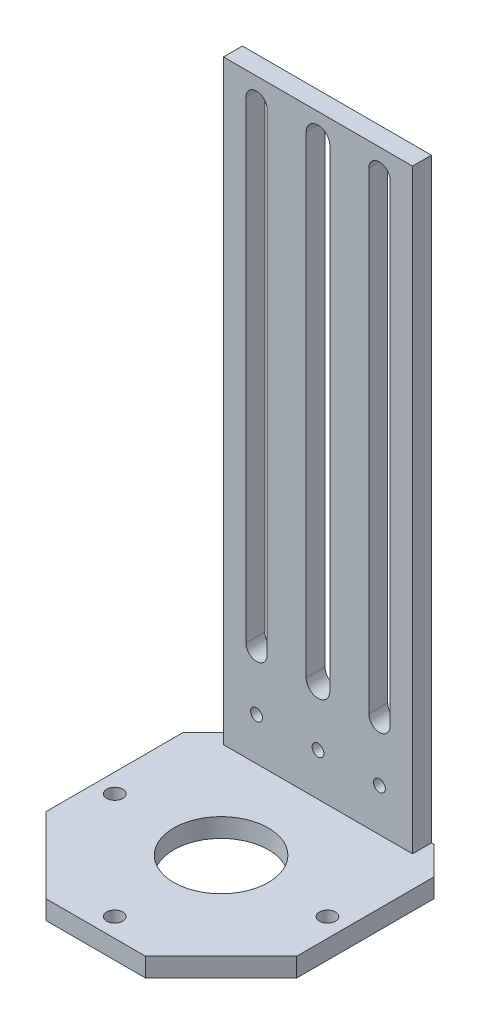
ISO-10303-21;
HEADER;
FILE_DESCRIPTION(('STEP AP214'),'2;1');
FILE_NAME('part.step','',(''),(''),'','','');
FILE_SCHEMA(('AUTOMOTIVE_DESIGN { 1 0 10303 214 1 1 1 1 }'));
ENDSEC;
DATA;
#1=APPLICATION_CONTEXT('core data for automotive mechanical design processes');
#2=APPLICATION_PROTOCOL_DEFINITION('international standard','automotive_design',2000,#1);
#3=PRODUCT_CONTEXT('',#1,'mechanical');
#4=PRODUCT('Part','Part','',(#3));
#5=PRODUCT_RELATED_PRODUCT_CATEGORY('part','',(#4));
#6=PRODUCT_DEFINITION_FORMATION('','',#4);
#7=PRODUCT_DEFINITION_CONTEXT('part definition',#1,'design');
#8=PRODUCT_DEFINITION('design','',#6,#7);
#9=PRODUCT_DEFINITION_SHAPE('','',#8);
#10=(LENGTH_UNIT() NAMED_UNIT(*) SI_UNIT(.MILLI.,.METRE.));
#11=(NAMED_UNIT(*) PLANE_ANGLE_UNIT() SI_UNIT($,.RADIAN.));
#12=(NAMED_UNIT(*) SI_UNIT($,.STERADIAN.) SOLID_ANGLE_UNIT());
#13=UNCERTAINTY_MEASURE_WITH_UNIT(LENGTH_MEASURE(1.E-05),#10,'distance_accuracy_value','');
#14=(GEOMETRIC_REPRESENTATION_CONTEXT(3) GLOBAL_UNCERTAINTY_ASSIGNED_CONTEXT((#13)) GLOBAL_UNIT_ASSIGNED_CONTEXT((#10,
#11,#12)) REPRESENTATION_CONTEXT('',''));
#15=CARTESIAN_POINT('',(0.,0.,0.));
#16=DIRECTION('',(0.,0.,1.));
#17=DIRECTION('',(1.,0.,0.));
#18=AXIS2_PLACEMENT_3D('',#15,#16,#17);
#19=CARTESIAN_POINT('',(26.5,130.,4.));
#20=DIRECTION('',(0.,0.,-1.));
#21=DIRECTION('',(0.,1.,0.));
#22=AXIS2_PLACEMENT_3D('',#19,#20,#21);
#23=PLANE('',#22);
#24=DIRECTION('',(0.,-1.,0.));
#25=VECTOR('',#24,1.);
#26=CARTESIAN_POINT('',(20.,130.,4.));
#27=LINE('',#26,#25);
#28=CARTESIAN_POINT('',(20.,4.,4.));
#29=VERTEX_POINT('',#28);
#30=CARTESIAN_POINT('',(20.,130.,4.));
#31=VERTEX_POINT('',#30);
#32=EDGE_CURVE('E401',#29,#31,#27,.F.);
#33=ORIENTED_EDGE('',*,*,#32,.T.);
#34=DIRECTION('',(1.,0.,0.));
#35=VECTOR('',#34,1.);
#36=CARTESIAN_POINT('',(26.5,130.,4.));
#37=LINE('',#36,#35);
#38=CARTESIAN_POINT('',(-20.,130.,4.));
#39=VERTEX_POINT('',#38);
#40=EDGE_CURVE('E396',#31,#39,#37,.F.);
#41=ORIENTED_EDGE('',*,*,#40,.T.);
#42=DIRECTION('',(0.,1.,0.));
#43=VECTOR('',#42,1.);
#44=CARTESIAN_POINT('',(-20.,130.,4.));
#45=LINE('',#44,#43);
#46=CARTESIAN_POINT('',(-20.,4.,4.));
#47=VERTEX_POINT('',#46);
#48=EDGE_CURVE('E387',#39,#47,#45,.F.);
#49=ORIENTED_EDGE('',*,*,#48,.T.);
#50=DIRECTION('',(1.,0.,0.));
#51=VECTOR('',#50,1.);
#52=CARTESIAN_POINT('',(26.5,4.00000000000001,4.));
#53=LINE('',#52,#51);
#54=EDGE_CURVE('E334',#47,#29,#53,.T.);
#55=ORIENTED_EDGE('',*,*,#54,.T.);
#56=EDGE_LOOP('',(#33,#41,#49,#55));
#57=FACE_BOUND('',#56,.T.);
#58=CARTESIAN_POINT('',(-13.,125.,4.));
#59=DIRECTION('',(0.,0.,-1.));
#60=DIRECTION('',(-1.,0.,0.));
#61=AXIS2_PLACEMENT_3D('',#58,#59,#60);
#62=CIRCLE('',#61,2.24999999999999);
#63=CARTESIAN_POINT('',(-15.25,125.,4.));
#64=VERTEX_POINT('',#63);
#65=CARTESIAN_POINT('',(-10.75,125.,4.));
#66=VERTEX_POINT('',#65);
#67=EDGE_CURVE('E254',#64,#66,#62,.T.);
#68=ORIENTED_EDGE('',*,*,#67,.T.);
#69=DIRECTION('',(0.,1.,0.));
#70=VECTOR('',#69,1.);
#71=CARTESIAN_POINT('',(-10.75,125.,4.));
#72=LINE('',#71,#70);
#73=CARTESIAN_POINT('',(-10.75,25.,4.));
#74=VERTEX_POINT('',#73);
#75=EDGE_CURVE('E308',#66,#74,#72,.F.);
#76=ORIENTED_EDGE('',*,*,#75,.T.);
#77=CARTESIAN_POINT('',(-13.,25.,4.));
#78=DIRECTION('',(0.,0.,-1.));
#79=DIRECTION('',(-1.,0.,0.));
#80=AXIS2_PLACEMENT_3D('',#77,#78,#79);
#81=CIRCLE('',#80,2.24999999999999);
#82=CARTESIAN_POINT('',(-15.25,25.,4.));
#83=VERTEX_POINT('',#82);
#84=EDGE_CURVE('E259',#74,#83,#81,.T.);
#85=ORIENTED_EDGE('',*,*,#84,.T.);
#86=DIRECTION('',(0.,-1.,0.));
#87=VECTOR('',#86,1.);
#88=CARTESIAN_POINT('',(-15.25,125.,4.));
#89=LINE('',#88,#87);
#90=EDGE_CURVE('E262',#83,#64,#89,.F.);
#91=ORIENTED_EDGE('',*,*,#90,.T.);
#92=EDGE_LOOP('',(#68,#76,#85,#91));
#93=FACE_BOUND('',#92,.T.);
#94=CARTESIAN_POINT('',(13.,125.,4.));
#95=DIRECTION('',(0.,0.,-1.));
#96=DIRECTION('',(-1.,0.,0.));
#97=AXIS2_PLACEMENT_3D('',#94,#95,#96);
#98=CIRCLE('',#97,2.24999999999999);
#99=CARTESIAN_POINT('',(10.75,125.,4.));
#100=VERTEX_POINT('',#99);
#101=CARTESIAN_POINT('',(15.25,125.,4.));
#102=VERTEX_POINT('',#101);
#103=EDGE_CURVE('E264',#100,#102,#98,.T.);
#104=ORIENTED_EDGE('',*,*,#103,.T.);
#105=DIRECTION('',(0.,1.,0.));
#106=VECTOR('',#105,1.);
#107=CARTESIAN_POINT('',(15.25,125.,4.));
#108=LINE('',#107,#106);
#109=CARTESIAN_POINT('',(15.25,25.,4.));
#110=VERTEX_POINT('',#109);
#111=EDGE_CURVE('E313',#102,#110,#108,.F.);
#112=ORIENTED_EDGE('',*,*,#111,.T.);
#113=CARTESIAN_POINT('',(13.,25.,4.));
#114=DIRECTION('',(0.,0.,-1.));
#115=DIRECTION('',(-1.,0.,0.));
#116=AXIS2_PLACEMENT_3D('',#113,#114,#115);
#117=CIRCLE('',#116,2.24999999999999);
#118=CARTESIAN_POINT('',(10.75,25.,4.));
#119=VERTEX_POINT('',#118);
#120=EDGE_CURVE('E269',#110,#119,#117,.T.);
#121=ORIENTED_EDGE('',*,*,#120,.T.);
#122=DIRECTION('',(0.,-1.,0.));
#123=VECTOR('',#122,1.);
#124=CARTESIAN_POINT('',(10.75,125.,4.));
#125=LINE('',#124,#123);
#126=EDGE_CURVE('E205',#119,#100,#125,.F.);
#127=ORIENTED_EDGE('',*,*,#126,.T.);
#128=EDGE_LOOP('',(#104,#112,#121,#127));
#129=FACE_BOUND('',#128,.T.);
#130=CARTESIAN_POINT('',(0.,25.,4.));
#131=DIRECTION('',(0.,0.,-1.));
#132=DIRECTION('',(-1.,0.,0.));
#133=AXIS2_PLACEMENT_3D('',#130,#131,#132);
#134=CIRCLE('',#133,2.5);
#135=CARTESIAN_POINT('',(2.5,25.,4.));
#136=VERTEX_POINT('',#135);
#137=CARTESIAN_POINT('',(-2.5,25.,4.));
#138=VERTEX_POINT('',#137);
#139=EDGE_CURVE('E197',#136,#138,#134,.T.);
#140=ORIENTED_EDGE('',*,*,#139,.T.);
#141=DIRECTION('',(0.,1.,0.));
#142=VECTOR('',#141,1.);
#143=CARTESIAN_POINT('',(-2.5,25.,4.));
#144=LINE('',#143,#142);
#145=CARTESIAN_POINT('',(-2.5,125.,4.));
#146=VERTEX_POINT('',#145);
#147=EDGE_CURVE('E190',#138,#146,#144,.T.);
#148=ORIENTED_EDGE('',*,*,#147,.T.);
#149=CARTESIAN_POINT('',(0.,125.,4.));
#150=DIRECTION('',(0.,0.,-1.));
#151=DIRECTION('',(-1.,0.,0.));
#152=AXIS2_PLACEMENT_3D('',#149,#150,#151);
#153=CIRCLE('',#152,2.5);
#154=CARTESIAN_POINT('',(2.5,125.,4.));
#155=VERTEX_POINT('',#154);
#156=EDGE_CURVE('E175',#146,#155,#153,.T.);
#157=ORIENTED_EDGE('',*,*,#156,.T.);
#158=DIRECTION('',(0.,1.,0.));
#159=VECTOR('',#158,1.);
#160=CARTESIAN_POINT('',(2.5,25.,4.));
#161=LINE('',#160,#159);
#162=EDGE_CURVE('E185',#155,#136,#161,.F.);
#163=ORIENTED_EDGE('',*,*,#162,.T.);
#164=EDGE_LOOP('',(#140,#148,#157,#163));
#165=FACE_BOUND('',#164,.T.);
#166=CARTESIAN_POINT('',(0.,13.,4.));
#167=DIRECTION('',(0.,0.,-1.));
#168=DIRECTION('',(-1.,0.,0.));
#169=AXIS2_PLACEMENT_3D('',#166,#167,#168);
#170=CIRCLE('',#169,1.24999999999999);
#171=CARTESIAN_POINT('',(-1.24999999999999,13.,4.));
#172=VERTEX_POINT('',#171);
#173=EDGE_CURVE('E186',#172,#172,#170,.T.);
#174=ORIENTED_EDGE('',*,*,#173,.T.);
#175=EDGE_LOOP('',(#174));
#176=FACE_BOUND('',#175,.T.);
#177=CARTESIAN_POINT('',(-13.,13.,4.));
#178=DIRECTION('',(0.,0.,-1.));
#179=DIRECTION('',(-1.,0.,0.));
#180=AXIS2_PLACEMENT_3D('',#177,#178,#179);
#181=CIRCLE('',#180,1.24999999999999);
#182=CARTESIAN_POINT('',(-14.25,13.,4.));
#183=VERTEX_POINT('',#182);
#184=EDGE_CURVE('E275',#183,#183,#181,.T.);
#185=ORIENTED_EDGE('',*,*,#184,.T.);
#186=EDGE_LOOP('',(#185));
#187=FACE_BOUND('',#186,.T.);
#188=CARTESIAN_POINT('',(13.,13.,4.));
#189=DIRECTION('',(0.,0.,-1.));
#190=DIRECTION('',(-1.,0.,0.));
#191=AXIS2_PLACEMENT_3D('',#188,#189,#190);
#192=CIRCLE('',#191,1.24999999999999);
#193=CARTESIAN_POINT('',(11.75,13.,4.));
#194=VERTEX_POINT('',#193);
#195=EDGE_CURVE('E278',#194,#194,#192,.T.);
#196=ORIENTED_EDGE('',*,*,#195,.T.);
#197=EDGE_LOOP('',(#196));
#198=FACE_BOUND('',#197,.T.);
#199=ADVANCED_FACE('F16',(#57,#93,#129,#165,#176,#187,#198),#23,.F.);
#200=CARTESIAN_POINT('',(-22.5,4.,24.5));
#201=DIRECTION('',(0.,1.,0.));
#202=DIRECTION('',(0.,0.,1.));
#203=AXIS2_PLACEMENT_3D('',#200,#201,#202);
#204=CYLINDRICAL_SURFACE('',#203,1.69999999999999);
#205=CARTESIAN_POINT('',(-22.5,0.,24.5));
#206=DIRECTION('',(0.,1.,0.));
#207=DIRECTION('',(0.,0.,1.));
#208=AXIS2_PLACEMENT_3D('',#205,#206,#207);
#209=CIRCLE('',#208,1.69999999999999);
#210=CARTESIAN_POINT('',(-22.5,0.,26.2));
#211=VERTEX_POINT('',#210);
#212=EDGE_CURVE('E250',#211,#211,#209,.F.);
#213=ORIENTED_EDGE('',*,*,#212,.T.);
#214=EDGE_LOOP('',(#213));
#215=FACE_BOUND('',#214,.T.);
#216=CARTESIAN_POINT('',(-22.5,4.00000000000001,24.5));
#217=DIRECTION('',(0.,1.,0.));
#218=DIRECTION('',(0.,0.,1.));
#219=AXIS2_PLACEMENT_3D('',#216,#217,#218);
#220=CIRCLE('',#219,1.69999999999999);
#221=CARTESIAN_POINT('',(-22.5,4.00000000000001,26.2));
#222=VERTEX_POINT('',#221);
#223=EDGE_CURVE('E19',#222,#222,#220,.T.);
#224=ORIENTED_EDGE('',*,*,#223,.T.);
#225=EDGE_LOOP('',(#224));
#226=FACE_BOUND('',#225,.T.);
#227=ADVANCED_FACE('F436',(#215,#226),#204,.F.);
#228=CARTESIAN_POINT('',(22.5,4.,24.5));
#229=DIRECTION('',(0.,1.,0.));
#230=DIRECTION('',(0.,0.,1.));
#231=AXIS2_PLACEMENT_3D('',#228,#229,#230);
#232=CYLINDRICAL_SURFACE('',#231,1.69999999999999);
#233=CARTESIAN_POINT('',(22.5,0.,24.5));
#234=DIRECTION('',(0.,1.,0.));
#235=DIRECTION('',(0.,0.,1.));
#236=AXIS2_PLACEMENT_3D('',#233,#234,#235);
#237=CIRCLE('',#236,1.69999999999999);
#238=CARTESIAN_POINT('',(22.5,0.,26.2));
#239=VERTEX_POINT('',#238);
#240=EDGE_CURVE('E247',#239,#239,#237,.F.);
#241=ORIENTED_EDGE('',*,*,#240,.T.);
#242=EDGE_LOOP('',(#241));
#243=FACE_BOUND('',#242,.T.);
#244=CARTESIAN_POINT('',(22.5,4.00000000000001,24.5));
#245=DIRECTION('',(0.,1.,0.));
#246=DIRECTION('',(0.,0.,1.));
#247=AXIS2_PLACEMENT_3D('',#244,#245,#246);
#248=CIRCLE('',#247,1.69999999999999);
#249=CARTESIAN_POINT('',(22.5,4.00000000000001,26.2));
#250=VERTEX_POINT('',#249);
#251=EDGE_CURVE('E288',#250,#250,#248,.T.);
#252=ORIENTED_EDGE('',*,*,#251,.T.);
#253=EDGE_LOOP('',(#252));
#254=FACE_BOUND('',#253,.T.);
#255=ADVANCED_FACE('F442',(#243,#254),#232,.F.);
#256=CARTESIAN_POINT('',(0.,4.,47.));
#257=DIRECTION('',(0.,1.,0.));
#258=DIRECTION('',(0.,0.,1.));
#259=AXIS2_PLACEMENT_3D('',#256,#257,#258);
#260=CYLINDRICAL_SURFACE('',#259,1.69999999999999);
#261=CARTESIAN_POINT('',(0.,0.,47.));
#262=DIRECTION('',(0.,1.,0.));
#263=DIRECTION('',(0.,0.,1.));
#264=AXIS2_PLACEMENT_3D('',#261,#262,#263);
#265=CIRCLE('',#264,1.69999999999999);
#266=CARTESIAN_POINT('',(0.,0.,48.7));
#267=VERTEX_POINT('',#266);
#268=EDGE_CURVE('E244',#267,#267,#265,.F.);
#269=ORIENTED_EDGE('',*,*,#268,.T.);
#270=EDGE_LOOP('',(#269));
#271=FACE_BOUND('',#270,.T.);
#272=CARTESIAN_POINT('',(0.,4.,47.));
#273=DIRECTION('',(0.,1.,0.));
#274=DIRECTION('',(0.,0.,1.));
#275=AXIS2_PLACEMENT_3D('',#272,#273,#274);
#276=CIRCLE('',#275,1.69999999999999);
#277=CARTESIAN_POINT('',(0.,4.,48.7));
#278=VERTEX_POINT('',#277);
#279=EDGE_CURVE('E286',#278,#278,#276,.T.);
#280=ORIENTED_EDGE('',*,*,#279,.T.);
#281=EDGE_LOOP('',(#280));
#282=FACE_BOUND('',#281,.T.);
#283=ADVANCED_FACE('F542',(#271,#282),#260,.F.);
#284=CARTESIAN_POINT('',(0.,0.,24.5));
#285=DIRECTION('',(0.,1.,0.));
#286=DIRECTION('',(0.,0.,1.));
#287=AXIS2_PLACEMENT_3D('',#284,#285,#286);
#288=CYLINDRICAL_SURFACE('',#287,10.);
#289=CARTESIAN_POINT('',(0.,0.,24.5));
#290=DIRECTION('',(0.,1.,0.));
#291=DIRECTION('',(0.,0.,1.));
#292=AXIS2_PLACEMENT_3D('',#289,#290,#291);
#293=CIRCLE('',#292,10.);
#294=CARTESIAN_POINT('',(0.,0.,34.5));
#295=VERTEX_POINT('',#294);
#296=EDGE_CURVE('E240',#295,#295,#293,.F.);
#297=ORIENTED_EDGE('',*,*,#296,.T.);
#298=EDGE_LOOP('',(#297));
#299=FACE_BOUND('',#298,.T.);
#300=CARTESIAN_POINT('',(0.,4.,24.5));
#301=DIRECTION('',(0.,1.,0.));
#302=DIRECTION('',(0.,0.,1.));
#303=AXIS2_PLACEMENT_3D('',#300,#301,#302);
#304=CIRCLE('',#303,10.);
#305=CARTESIAN_POINT('',(0.,4.,34.5));
#306=VERTEX_POINT('',#305);
#307=EDGE_CURVE('E282',#306,#306,#304,.T.);
#308=ORIENTED_EDGE('',*,*,#307,.T.);
#309=EDGE_LOOP('',(#308));
#310=FACE_BOUND('',#309,.T.);
#311=ADVANCED_FACE('F538',(#299,#310),#288,.F.);
#312=CARTESIAN_POINT('',(-26.5,0.,0.));
#313=DIRECTION('',(1.,0.,0.));
#314=DIRECTION('',(0.,0.,-1.));
#315=AXIS2_PLACEMENT_3D('',#312,#313,#314);
#316=PLANE('',#315);
#317=DIRECTION('',(0.,1.,0.));
#318=VECTOR('',#317,1.);
#319=CARTESIAN_POINT('',(-26.5,0.,6.00000000000003));
#320=LINE('',#319,#318);
#321=CARTESIAN_POINT('',(-26.5,4.00000000000001,6.00000000000003));
#322=VERTEX_POINT('',#321);
#323=CARTESIAN_POINT('',(-26.5,0.,6.00000000000003));
#324=VERTEX_POINT('',#323);
#325=EDGE_CURVE('E253',#322,#324,#320,.F.);
#326=ORIENTED_EDGE('',*,*,#325,.T.);
#327=DIRECTION('',(0.,0.,1.));
#328=VECTOR('',#327,1.);
#329=CARTESIAN_POINT('',(-26.5,0.,51.));
#330=LINE('',#329,#328);
#331=CARTESIAN_POINT('',(-26.5,0.,35.));
#332=VERTEX_POINT('',#331);
#333=EDGE_CURVE('E378',#324,#332,#330,.T.);
#334=ORIENTED_EDGE('',*,*,#333,.T.);
#335=DIRECTION('',(0.,1.,0.));
#336=VECTOR('',#335,1.);
#337=CARTESIAN_POINT('',(-26.5,4.,35.));
#338=LINE('',#337,#336);
#339=CARTESIAN_POINT('',(-26.5,4.,35.));
#340=VERTEX_POINT('',#339);
#341=EDGE_CURVE('E302',#332,#340,#338,.T.);
#342=ORIENTED_EDGE('',*,*,#341,.T.);
#343=DIRECTION('',(0.,0.,-1.));
#344=VECTOR('',#343,1.);
#345=CARTESIAN_POINT('',(-26.5,4.00000000000001,4.));
#346=LINE('',#345,#344);
#347=EDGE_CURVE('E338',#340,#322,#346,.T.);
#348=ORIENTED_EDGE('',*,*,#347,.T.);
#349=EDGE_LOOP('',(#326,#334,#342,#348));
#350=FACE_BOUND('',#349,.T.);
#351=ADVANCED_FACE('F534',(#350),#316,.F.);
#352=CARTESIAN_POINT('',(-10.5,4.,51.));
#353=DIRECTION('',(0.707106781186549,0.,-0.707106781186546));
#354=DIRECTION('',(-0.707106781186546,0.,-0.707106781186549));
#355=AXIS2_PLACEMENT_3D('',#352,#353,#354);
#356=PLANE('',#355);
#357=ORIENTED_EDGE('',*,*,#341,.F.);
#358=DIRECTION('',(0.707106781186546,0.,0.707106781186549));
#359=VECTOR('',#358,1.);
#360=CARTESIAN_POINT('',(-26.5,0.,35.));
#361=LINE('',#360,#359);
#362=CARTESIAN_POINT('',(-10.5,0.,51.));
#363=VERTEX_POINT('',#362);
#364=EDGE_CURVE('E375',#332,#363,#361,.T.);
#365=ORIENTED_EDGE('',*,*,#364,.T.);
#366=DIRECTION('',(0.,1.,0.));
#367=VECTOR('',#366,1.);
#368=CARTESIAN_POINT('',(-10.5,4.,51.));
#369=LINE('',#368,#367);
#370=CARTESIAN_POINT('',(-10.5,4.,51.));
#371=VERTEX_POINT('',#370);
#372=EDGE_CURVE('E296',#363,#371,#369,.T.);
#373=ORIENTED_EDGE('',*,*,#372,.T.);
#374=DIRECTION('',(-0.707106781186546,0.,-0.707106781186549));
#375=VECTOR('',#374,1.);
#376=CARTESIAN_POINT('',(-10.5,4.,51.));
#377=LINE('',#376,#375);
#378=EDGE_CURVE('E340',#371,#340,#377,.T.);
#379=ORIENTED_EDGE('',*,*,#378,.T.);
#380=EDGE_LOOP('',(#357,#365,#373,#379));
#381=FACE_BOUND('',#380,.T.);
#382=ADVANCED_FACE('F531',(#381),#356,.F.);
#383=CARTESIAN_POINT('',(26.5,4.,51.));
#384=DIRECTION('',(0.,0.,-1.));
#385=DIRECTION('',(-1.,0.,0.));
#386=AXIS2_PLACEMENT_3D('',#383,#384,#385);
#387=PLANE('',#386);
#388=ORIENTED_EDGE('',*,*,#372,.F.);
#389=DIRECTION('',(1.,0.,0.));
#390=VECTOR('',#389,1.);
#391=CARTESIAN_POINT('',(26.5,0.,51.));
#392=LINE('',#391,#390);
#393=CARTESIAN_POINT('',(10.4999999999999,0.,51.));
#394=VERTEX_POINT('',#393);
#395=EDGE_CURVE('E372',#363,#394,#392,.T.);
#396=ORIENTED_EDGE('',*,*,#395,.T.);
#397=DIRECTION('',(0.,1.,0.));
#398=VECTOR('',#397,1.);
#399=CARTESIAN_POINT('',(10.4999999999999,0.,51.));
#400=LINE('',#399,#398);
#401=CARTESIAN_POINT('',(10.4999999999999,4.,51.));
#402=VERTEX_POINT('',#401);
#403=EDGE_CURVE('E293',#402,#394,#400,.F.);
#404=ORIENTED_EDGE('',*,*,#403,.F.);
#405=DIRECTION('',(1.,0.,0.));
#406=VECTOR('',#405,1.);
#407=CARTESIAN_POINT('',(26.5,4.,51.));
#408=LINE('',#407,#406);
#409=EDGE_CURVE('E342',#402,#371,#408,.F.);
#410=ORIENTED_EDGE('',*,*,#409,.T.);
#411=EDGE_LOOP('',(#388,#396,#404,#410));
#412=FACE_BOUND('',#411,.T.);
#413=ADVANCED_FACE('F528',(#412),#387,.F.);
#414=CARTESIAN_POINT('',(26.5,0.,35.));
#415=DIRECTION('',(0.707106781186546,0.,0.707106781186549));
#416=DIRECTION('',(0.707106781186549,0.,-0.707106781186546));
#417=AXIS2_PLACEMENT_3D('',#414,#415,#416);
#418=PLANE('',#417);
#419=DIRECTION('',(0.707106781186549,0.,-0.707106781186546));
#420=VECTOR('',#419,1.);
#421=CARTESIAN_POINT('',(10.4999999999999,0.,51.));
#422=LINE('',#421,#420);
#423=CARTESIAN_POINT('',(26.5,0.,35.));
#424=VERTEX_POINT('',#423);
#425=EDGE_CURVE('E370',#394,#424,#422,.T.);
#426=ORIENTED_EDGE('',*,*,#425,.T.);
#427=DIRECTION('',(0.,1.,0.));
#428=VECTOR('',#427,1.);
#429=CARTESIAN_POINT('',(26.5,0.,35.));
#430=LINE('',#429,#428);
#431=CARTESIAN_POINT('',(26.5,4.,35.));
#432=VERTEX_POINT('',#431);
#433=EDGE_CURVE('E281',#432,#424,#430,.F.);
#434=ORIENTED_EDGE('',*,*,#433,.F.);
#435=DIRECTION('',(-0.707106781186549,0.,0.707106781186546));
#436=VECTOR('',#435,1.);
#437=CARTESIAN_POINT('',(26.5,4.,35.));
#438=LINE('',#437,#436);
#439=EDGE_CURVE('E285',#432,#402,#438,.T.);
#440=ORIENTED_EDGE('',*,*,#439,.T.);
#441=ORIENTED_EDGE('',*,*,#403,.T.);
#442=EDGE_LOOP('',(#426,#434,#440,#441));
#443=FACE_BOUND('',#442,.T.);
#444=ADVANCED_FACE('F347',(#443),#418,.T.);
#445=CARTESIAN_POINT('',(26.5,4.00000000000001,4.));
#446=DIRECTION('',(0.,-1.,0.));
#447=DIRECTION('',(0.,0.,-1.));
#448=AXIS2_PLACEMENT_3D('',#445,#446,#447);
#449=PLANE('',#448);
#450=DIRECTION('',(-0.707106781186549,0.,-0.707106781186546));
#451=VECTOR('',#450,1.);
#452=CARTESIAN_POINT('',(26.5,4.,6.00000000000001));
#453=LINE('',#452,#451);
#454=CARTESIAN_POINT('',(20.5,4.,0.));
#455=VERTEX_POINT('',#454);
#456=CARTESIAN_POINT('',(26.5,4.,6.));
#457=VERTEX_POINT('',#456);
#458=EDGE_CURVE('E361',#455,#457,#453,.F.);
#459=ORIENTED_EDGE('',*,*,#458,.F.);
#460=DIRECTION('',(1.,0.,0.));
#461=VECTOR('',#460,1.);
#462=CARTESIAN_POINT('',(26.5,4.00000000000001,0.));
#463=LINE('',#462,#461);
#464=CARTESIAN_POINT('',(20.,4.,0.));
#465=VERTEX_POINT('',#464);
#466=EDGE_CURVE('E34',#465,#455,#463,.T.);
#467=ORIENTED_EDGE('',*,*,#466,.F.);
#468=DIRECTION('',(0.,0.,1.));
#469=VECTOR('',#468,1.);
#470=CARTESIAN_POINT('',(20.,4.,0.));
#471=LINE('',#470,#469);
#472=EDGE_CURVE('E403',#465,#29,#471,.T.);
#473=ORIENTED_EDGE('',*,*,#472,.T.);
#474=ORIENTED_EDGE('',*,*,#54,.F.);
#475=DIRECTION('',(0.,0.,1.));
#476=VECTOR('',#475,1.);
#477=CARTESIAN_POINT('',(-20.,4.,0.));
#478=LINE('',#477,#476);
#479=CARTESIAN_POINT('',(-20.,4.,0.));
#480=VERTEX_POINT('',#479);
#481=EDGE_CURVE('E393',#47,#480,#478,.F.);
#482=ORIENTED_EDGE('',*,*,#481,.T.);
#483=DIRECTION('',(1.,0.,0.));
#484=VECTOR('',#483,1.);
#485=CARTESIAN_POINT('',(26.5,4.00000000000001,0.));
#486=LINE('',#485,#484);
#487=CARTESIAN_POINT('',(-20.5,4.,0.));
#488=VERTEX_POINT('',#487);
#489=EDGE_CURVE('E336',#488,#480,#486,.T.);
#490=ORIENTED_EDGE('',*,*,#489,.F.);
#491=DIRECTION('',(0.707106781186546,0.,-0.707106781186549));
#492=VECTOR('',#491,1.);
#493=CARTESIAN_POINT('',(-20.5,4.,0.));
#494=LINE('',#493,#492);
#495=EDGE_CURVE('E384',#488,#322,#494,.F.);
#496=ORIENTED_EDGE('',*,*,#495,.T.);
#497=ORIENTED_EDGE('',*,*,#347,.F.);
#498=ORIENTED_EDGE('',*,*,#378,.F.);
#499=ORIENTED_EDGE('',*,*,#409,.F.);
#500=ORIENTED_EDGE('',*,*,#439,.F.);
#501=DIRECTION('',(0.,0.,-1.));
#502=VECTOR('',#501,1.);
#503=CARTESIAN_POINT('',(26.5,4.00000000000001,0.));
#504=LINE('',#503,#502);
#505=EDGE_CURVE('E330',#457,#432,#504,.F.);
#506=ORIENTED_EDGE('',*,*,#505,.F.);
#507=EDGE_LOOP('',(#459,#467,#473,#474,#482,#490,#496,#497,#498,#499,#500,#506));
#508=FACE_BOUND('',#507,.T.);
#509=ORIENTED_EDGE('',*,*,#307,.F.);
#510=EDGE_LOOP('',(#509));
#511=FACE_BOUND('',#510,.T.);
#512=ORIENTED_EDGE('',*,*,#279,.F.);
#513=EDGE_LOOP('',(#512));
#514=FACE_BOUND('',#513,.T.);
#515=ORIENTED_EDGE('',*,*,#251,.F.);
#516=EDGE_LOOP('',(#515));
#517=FACE_BOUND('',#516,.T.);
#518=ORIENTED_EDGE('',*,*,#223,.F.);
#519=EDGE_LOOP('',(#518));
#520=FACE_BOUND('',#519,.T.);
#521=ADVANCED_FACE('F350',(#508,#511,#514,#517,#520),#449,.F.);
#522=CARTESIAN_POINT('',(26.5,0.,0.));
#523=DIRECTION('',(1.,0.,0.));
#524=DIRECTION('',(0.,0.,-1.));
#525=AXIS2_PLACEMENT_3D('',#522,#523,#524);
#526=PLANE('',#525);
#527=ORIENTED_EDGE('',*,*,#505,.T.);
#528=ORIENTED_EDGE('',*,*,#433,.T.);
#529=DIRECTION('',(0.,0.,1.));
#530=VECTOR('',#529,1.);
#531=CARTESIAN_POINT('',(26.5,0.,51.));
#532=LINE('',#531,#530);
#533=CARTESIAN_POINT('',(26.5,0.,6.));
#534=VERTEX_POINT('',#533);
#535=EDGE_CURVE('E358',#424,#534,#532,.F.);
#536=ORIENTED_EDGE('',*,*,#535,.T.);
#537=DIRECTION('',(0.,1.,0.));
#538=VECTOR('',#537,1.);
#539=CARTESIAN_POINT('',(26.5,0.,6.00000000000001));
#540=LINE('',#539,#538);
#541=EDGE_CURVE('E239',#457,#534,#540,.F.);
#542=ORIENTED_EDGE('',*,*,#541,.F.);
#543=EDGE_LOOP('',(#527,#528,#536,#542));
#544=FACE_BOUND('',#543,.T.);
#545=ADVANCED_FACE('F355',(#544),#526,.T.);
#546=CARTESIAN_POINT('',(13.,13.,0.));
#547=DIRECTION('',(0.,0.,-1.));
#548=DIRECTION('',(-1.,0.,0.));
#549=AXIS2_PLACEMENT_3D('',#546,#547,#548);
#550=CYLINDRICAL_SURFACE('',#549,1.24999999999999);
#551=ORIENTED_EDGE('',*,*,#195,.F.);
#552=EDGE_LOOP('',(#551));
#553=FACE_BOUND('',#552,.T.);
#554=CARTESIAN_POINT('',(13.,13.,0.));
#555=DIRECTION('',(0.,0.,-1.));
#556=DIRECTION('',(-1.,0.,0.));
#557=AXIS2_PLACEMENT_3D('',#554,#555,#556);
#558=CIRCLE('',#557,1.24999999999999);
#559=CARTESIAN_POINT('',(11.75,13.,0.));
#560=VERTEX_POINT('',#559);
#561=EDGE_CURVE('E236',#560,#560,#558,.T.);
#562=ORIENTED_EDGE('',*,*,#561,.T.);
#563=EDGE_LOOP('',(#562));
#564=FACE_BOUND('',#563,.T.);
#565=ADVANCED_FACE('F517',(#553,#564),#550,.F.);
#566=CARTESIAN_POINT('',(-13.,13.,0.));
#567=DIRECTION('',(0.,0.,-1.));
#568=DIRECTION('',(-1.,0.,0.));
#569=AXIS2_PLACEMENT_3D('',#566,#567,#568);
#570=CYLINDRICAL_SURFACE('',#569,1.24999999999999);
#571=ORIENTED_EDGE('',*,*,#184,.F.);
#572=EDGE_LOOP('',(#571));
#573=FACE_BOUND('',#572,.T.);
#574=CARTESIAN_POINT('',(-13.,13.,0.));
#575=DIRECTION('',(0.,0.,-1.));
#576=DIRECTION('',(-1.,0.,0.));
#577=AXIS2_PLACEMENT_3D('',#574,#575,#576);
#578=CIRCLE('',#577,1.24999999999999);
#579=CARTESIAN_POINT('',(-14.25,13.,0.));
#580=VERTEX_POINT('',#579);
#581=EDGE_CURVE('E233',#580,#580,#578,.T.);
#582=ORIENTED_EDGE('',*,*,#581,.T.);
#583=EDGE_LOOP('',(#582));
#584=FACE_BOUND('',#583,.T.);
#585=ADVANCED_FACE('F513',(#573,#584),#570,.F.);
#586=CARTESIAN_POINT('',(0.,13.,0.));
#587=DIRECTION('',(0.,0.,-1.));
#588=DIRECTION('',(-1.,0.,0.));
#589=AXIS2_PLACEMENT_3D('',#586,#587,#588);
#590=CYLINDRICAL_SURFACE('',#589,1.24999999999999);
#591=ORIENTED_EDGE('',*,*,#173,.F.);
#592=EDGE_LOOP('',(#591));
#593=FACE_BOUND('',#592,.T.);
#594=CARTESIAN_POINT('',(0.,13.,0.));
#595=DIRECTION('',(0.,0.,-1.));
#596=DIRECTION('',(-1.,0.,0.));
#597=AXIS2_PLACEMENT_3D('',#594,#595,#596);
#598=CIRCLE('',#597,1.24999999999999);
#599=CARTESIAN_POINT('',(-1.24999999999999,13.,0.));
#600=VERTEX_POINT('',#599);
#601=EDGE_CURVE('E230',#600,#600,#598,.T.);
#602=ORIENTED_EDGE('',*,*,#601,.T.);
#603=EDGE_LOOP('',(#602));
#604=FACE_BOUND('',#603,.T.);
#605=ADVANCED_FACE('F510',(#593,#604),#590,.F.);
#606=CARTESIAN_POINT('',(0.,125.,51.));
#607=DIRECTION('',(0.,0.,-1.));
#608=DIRECTION('',(-1.,0.,0.));
#609=AXIS2_PLACEMENT_3D('',#606,#607,#608);
#610=CYLINDRICAL_SURFACE('',#609,2.5);
#611=CARTESIAN_POINT('',(0.,125.,0.));
#612=DIRECTION('',(0.,0.,-1.));
#613=DIRECTION('',(-1.,0.,0.));
#614=AXIS2_PLACEMENT_3D('',#611,#612,#613);
#615=CIRCLE('',#614,2.5);
#616=CARTESIAN_POINT('',(-2.5,125.,0.));
#617=VERTEX_POINT('',#616);
#618=CARTESIAN_POINT('',(2.5,125.,0.));
#619=VERTEX_POINT('',#618);
#620=EDGE_CURVE('E228',#617,#619,#615,.T.);
#621=ORIENTED_EDGE('',*,*,#620,.T.);
#622=DIRECTION('',(0.,0.,-1.));
#623=VECTOR('',#622,1.);
#624=CARTESIAN_POINT('',(2.5,125.,51.));
#625=LINE('',#624,#623);
#626=EDGE_CURVE('E181',#619,#155,#625,.F.);
#627=ORIENTED_EDGE('',*,*,#626,.T.);
#628=ORIENTED_EDGE('',*,*,#156,.F.);
#629=DIRECTION('',(0.,0.,1.));
#630=VECTOR('',#629,1.);
#631=CARTESIAN_POINT('',(-2.5,125.,51.));
#632=LINE('',#631,#630);
#633=EDGE_CURVE('E179',#146,#617,#632,.F.);
#634=ORIENTED_EDGE('',*,*,#633,.T.);
#635=EDGE_LOOP('',(#621,#627,#628,#634));
#636=FACE_BOUND('',#635,.T.);
#637=ADVANCED_FACE('F178',(#636),#610,.F.);
#638=CARTESIAN_POINT('',(2.5,25.,51.));
#639=DIRECTION('',(1.,0.,0.));
#640=DIRECTION('',(0.,0.,-1.));
#641=AXIS2_PLACEMENT_3D('',#638,#639,#640);
#642=PLANE('',#641);
#643=DIRECTION('',(0.,1.,0.));
#644=VECTOR('',#643,1.);
#645=CARTESIAN_POINT('',(2.5,0.,0.));
#646=LINE('',#645,#644);
#647=CARTESIAN_POINT('',(2.5,25.,0.));
#648=VERTEX_POINT('',#647);
#649=EDGE_CURVE('E227',#619,#648,#646,.F.);
#650=ORIENTED_EDGE('',*,*,#649,.T.);
#651=DIRECTION('',(0.,0.,-1.));
#652=VECTOR('',#651,1.);
#653=CARTESIAN_POINT('',(2.5,25.,51.));
#654=LINE('',#653,#652);
#655=EDGE_CURVE('E199',#648,#136,#654,.F.);
#656=ORIENTED_EDGE('',*,*,#655,.T.);
#657=ORIENTED_EDGE('',*,*,#162,.F.);
#658=ORIENTED_EDGE('',*,*,#626,.F.);
#659=EDGE_LOOP('',(#650,#656,#657,#658));
#660=FACE_BOUND('',#659,.T.);
#661=ADVANCED_FACE('F503',(#660),#642,.F.);
#662=CARTESIAN_POINT('',(0.,25.,51.));
#663=DIRECTION('',(0.,0.,-1.));
#664=DIRECTION('',(-1.,0.,0.));
#665=AXIS2_PLACEMENT_3D('',#662,#663,#664);
#666=CYLINDRICAL_SURFACE('',#665,2.5);
#667=CARTESIAN_POINT('',(0.,25.,0.));
#668=DIRECTION('',(0.,0.,-1.));
#669=DIRECTION('',(-1.,0.,0.));
#670=AXIS2_PLACEMENT_3D('',#667,#668,#669);
#671=CIRCLE('',#670,2.5);
#672=CARTESIAN_POINT('',(-2.5,25.,0.));
#673=VERTEX_POINT('',#672);
#674=EDGE_CURVE('E224',#648,#673,#671,.T.);
#675=ORIENTED_EDGE('',*,*,#674,.T.);
#676=DIRECTION('',(0.,0.,1.));
#677=VECTOR('',#676,1.);
#678=CARTESIAN_POINT('',(-2.5,25.,51.));
#679=LINE('',#678,#677);
#680=EDGE_CURVE('E194',#673,#138,#679,.T.);
#681=ORIENTED_EDGE('',*,*,#680,.T.);
#682=ORIENTED_EDGE('',*,*,#139,.F.);
#683=ORIENTED_EDGE('',*,*,#655,.F.);
#684=EDGE_LOOP('',(#675,#681,#682,#683));
#685=FACE_BOUND('',#684,.T.);
#686=ADVANCED_FACE('F500',(#685),#666,.F.);
#687=CARTESIAN_POINT('',(-2.5,25.,51.));
#688=DIRECTION('',(-1.,0.,0.));
#689=DIRECTION('',(0.,0.,1.));
#690=AXIS2_PLACEMENT_3D('',#687,#688,#689);
#691=PLANE('',#690);
#692=DIRECTION('',(0.,1.,0.));
#693=VECTOR('',#692,1.);
#694=CARTESIAN_POINT('',(-2.5,0.,0.));
#695=LINE('',#694,#693);
#696=EDGE_CURVE('E193',#673,#617,#695,.T.);
#697=ORIENTED_EDGE('',*,*,#696,.T.);
#698=ORIENTED_EDGE('',*,*,#633,.F.);
#699=ORIENTED_EDGE('',*,*,#147,.F.);
#700=ORIENTED_EDGE('',*,*,#680,.F.);
#701=EDGE_LOOP('',(#697,#698,#699,#700));
#702=FACE_BOUND('',#701,.T.);
#703=ADVANCED_FACE('F189',(#702),#691,.F.);
#704=CARTESIAN_POINT('',(13.,25.,51.));
#705=DIRECTION('',(0.,0.,-1.));
#706=DIRECTION('',(-1.,0.,0.));
#707=AXIS2_PLACEMENT_3D('',#704,#705,#706);
#708=CYLINDRICAL_SURFACE('',#707,2.24999999999999);
#709=CARTESIAN_POINT('',(13.,25.,0.));
#710=DIRECTION('',(0.,0.,-1.));
#711=DIRECTION('',(-1.,0.,0.));
#712=AXIS2_PLACEMENT_3D('',#709,#710,#711);
#713=CIRCLE('',#712,2.24999999999999);
#714=CARTESIAN_POINT('',(15.25,25.,0.));
#715=VERTEX_POINT('',#714);
#716=CARTESIAN_POINT('',(10.75,25.,0.));
#717=VERTEX_POINT('',#716);
#718=EDGE_CURVE('E221',#715,#717,#713,.T.);
#719=ORIENTED_EDGE('',*,*,#718,.T.);
#720=DIRECTION('',(0.,0.,1.));
#721=VECTOR('',#720,1.);
#722=CARTESIAN_POINT('',(10.75,25.,51.));
#723=LINE('',#722,#721);
#724=EDGE_CURVE('E268',#717,#119,#723,.T.);
#725=ORIENTED_EDGE('',*,*,#724,.T.);
#726=ORIENTED_EDGE('',*,*,#120,.F.);
#727=DIRECTION('',(0.,0.,1.));
#728=VECTOR('',#727,1.);
#729=CARTESIAN_POINT('',(15.25,25.,51.));
#730=LINE('',#729,#728);
#731=EDGE_CURVE('E315',#110,#715,#730,.F.);
#732=ORIENTED_EDGE('',*,*,#731,.T.);
#733=EDGE_LOOP('',(#719,#725,#726,#732));
#734=FACE_BOUND('',#733,.T.);
#735=ADVANCED_FACE('F434',(#734),#708,.F.);
#736=CARTESIAN_POINT('',(10.75,125.,51.));
#737=DIRECTION('',(-1.,0.,0.));
#738=DIRECTION('',(0.,-1.,0.));
#739=AXIS2_PLACEMENT_3D('',#736,#737,#738);
#740=PLANE('',#739);
#741=DIRECTION('',(0.,1.,0.));
#742=VECTOR('',#741,1.);
#743=CARTESIAN_POINT('',(10.75,0.,0.));
#744=LINE('',#743,#742);
#745=CARTESIAN_POINT('',(10.75,125.,0.));
#746=VERTEX_POINT('',#745);
#747=EDGE_CURVE('E220',#717,#746,#744,.T.);
#748=ORIENTED_EDGE('',*,*,#747,.T.);
#749=DIRECTION('',(0.,0.,-1.));
#750=VECTOR('',#749,1.);
#751=CARTESIAN_POINT('',(10.75,125.,51.));
#752=LINE('',#751,#750);
#753=EDGE_CURVE('E267',#746,#100,#752,.F.);
#754=ORIENTED_EDGE('',*,*,#753,.T.);
#755=ORIENTED_EDGE('',*,*,#126,.F.);
#756=ORIENTED_EDGE('',*,*,#724,.F.);
#757=EDGE_LOOP('',(#748,#754,#755,#756));
#758=FACE_BOUND('',#757,.T.);
#759=ADVANCED_FACE('F432',(#758),#740,.F.);
#760=CARTESIAN_POINT('',(13.,125.,51.));
#761=DIRECTION('',(0.,0.,-1.));
#762=DIRECTION('',(-1.,0.,0.));
#763=AXIS2_PLACEMENT_3D('',#760,#761,#762);
#764=CYLINDRICAL_SURFACE('',#763,2.24999999999999);
#765=CARTESIAN_POINT('',(13.,125.,0.));
#766=DIRECTION('',(0.,0.,-1.));
#767=DIRECTION('',(-1.,0.,0.));
#768=AXIS2_PLACEMENT_3D('',#765,#766,#767);
#769=CIRCLE('',#768,2.24999999999999);
#770=CARTESIAN_POINT('',(15.25,125.,0.));
#771=VERTEX_POINT('',#770);
#772=EDGE_CURVE('E217',#746,#771,#769,.T.);
#773=ORIENTED_EDGE('',*,*,#772,.T.);
#774=DIRECTION('',(0.,0.,1.));
#775=VECTOR('',#774,1.);
#776=CARTESIAN_POINT('',(15.25,125.,51.));
#777=LINE('',#776,#775);
#778=EDGE_CURVE('E263',#771,#102,#777,.T.);
#779=ORIENTED_EDGE('',*,*,#778,.T.);
#780=ORIENTED_EDGE('',*,*,#103,.F.);
#781=ORIENTED_EDGE('',*,*,#753,.F.);
#782=EDGE_LOOP('',(#773,#779,#780,#781));
#783=FACE_BOUND('',#782,.T.);
#784=ADVANCED_FACE('F416',(#783),#764,.F.);
#785=CARTESIAN_POINT('',(15.25,125.,51.));
#786=DIRECTION('',(1.,0.,0.));
#787=DIRECTION('',(0.,1.,0.));
#788=AXIS2_PLACEMENT_3D('',#785,#786,#787);
#789=PLANE('',#788);
#790=DIRECTION('',(0.,1.,0.));
#791=VECTOR('',#790,1.);
#792=CARTESIAN_POINT('',(15.25,0.,0.));
#793=LINE('',#792,#791);
#794=EDGE_CURVE('E216',#771,#715,#793,.F.);
#795=ORIENTED_EDGE('',*,*,#794,.T.);
#796=ORIENTED_EDGE('',*,*,#731,.F.);
#797=ORIENTED_EDGE('',*,*,#111,.F.);
#798=ORIENTED_EDGE('',*,*,#778,.F.);
#799=EDGE_LOOP('',(#795,#796,#797,#798));
#800=FACE_BOUND('',#799,.T.);
#801=ADVANCED_FACE('F422',(#800),#789,.F.);
#802=CARTESIAN_POINT('',(-13.,25.,51.));
#803=DIRECTION('',(0.,0.,-1.));
#804=DIRECTION('',(-1.,0.,0.));
#805=AXIS2_PLACEMENT_3D('',#802,#803,#804);
#806=CYLINDRICAL_SURFACE('',#805,2.24999999999999);
#807=CARTESIAN_POINT('',(-13.,25.,0.));
#808=DIRECTION('',(0.,0.,-1.));
#809=DIRECTION('',(-1.,0.,0.));
#810=AXIS2_PLACEMENT_3D('',#807,#808,#809);
#811=CIRCLE('',#810,2.24999999999999);
#812=CARTESIAN_POINT('',(-10.75,25.,0.));
#813=VERTEX_POINT('',#812);
#814=CARTESIAN_POINT('',(-15.25,25.,0.));
#815=VERTEX_POINT('',#814);
#816=EDGE_CURVE('E213',#813,#815,#811,.T.);
#817=ORIENTED_EDGE('',*,*,#816,.T.);
#818=DIRECTION('',(0.,0.,1.));
#819=VECTOR('',#818,1.);
#820=CARTESIAN_POINT('',(-15.25,25.,51.));
#821=LINE('',#820,#819);
#822=EDGE_CURVE('E258',#815,#83,#821,.T.);
#823=ORIENTED_EDGE('',*,*,#822,.T.);
#824=ORIENTED_EDGE('',*,*,#84,.F.);
#825=DIRECTION('',(0.,0.,1.));
#826=VECTOR('',#825,1.);
#827=CARTESIAN_POINT('',(-10.75,25.,51.));
#828=LINE('',#827,#826);
#829=EDGE_CURVE('E311',#74,#813,#828,.F.);
#830=ORIENTED_EDGE('',*,*,#829,.T.);
#831=EDGE_LOOP('',(#817,#823,#824,#830));
#832=FACE_BOUND('',#831,.T.);
#833=ADVANCED_FACE('F485',(#832),#806,.F.);
#834=CARTESIAN_POINT('',(-15.25,125.,51.));
#835=DIRECTION('',(-1.,0.,0.));
#836=DIRECTION('',(0.,-1.,0.));
#837=AXIS2_PLACEMENT_3D('',#834,#835,#836);
#838=PLANE('',#837);
#839=DIRECTION('',(0.,1.,0.));
#840=VECTOR('',#839,1.);
#841=CARTESIAN_POINT('',(-15.25,0.,0.));
#842=LINE('',#841,#840);
#843=CARTESIAN_POINT('',(-15.25,125.,0.));
#844=VERTEX_POINT('',#843);
#845=EDGE_CURVE('E212',#815,#844,#842,.T.);
#846=ORIENTED_EDGE('',*,*,#845,.T.);
#847=DIRECTION('',(0.,0.,-1.));
#848=VECTOR('',#847,1.);
#849=CARTESIAN_POINT('',(-15.25,125.,51.));
#850=LINE('',#849,#848);
#851=EDGE_CURVE('E257',#844,#64,#850,.F.);
#852=ORIENTED_EDGE('',*,*,#851,.T.);
#853=ORIENTED_EDGE('',*,*,#90,.F.);
#854=ORIENTED_EDGE('',*,*,#822,.F.);
#855=EDGE_LOOP('',(#846,#852,#853,#854));
#856=FACE_BOUND('',#855,.T.);
#857=ADVANCED_FACE('F481',(#856),#838,.F.);
#858=CARTESIAN_POINT('',(-13.,125.,51.));
#859=DIRECTION('',(0.,0.,-1.));
#860=DIRECTION('',(-1.,0.,0.));
#861=AXIS2_PLACEMENT_3D('',#858,#859,#860);
#862=CYLINDRICAL_SURFACE('',#861,2.24999999999999);
#863=CARTESIAN_POINT('',(-13.,125.,0.));
#864=DIRECTION('',(0.,0.,-1.));
#865=DIRECTION('',(-1.,0.,0.));
#866=AXIS2_PLACEMENT_3D('',#863,#864,#865);
#867=CIRCLE('',#866,2.24999999999999);
#868=CARTESIAN_POINT('',(-10.75,125.,0.));
#869=VERTEX_POINT('',#868);
#870=EDGE_CURVE('E208',#844,#869,#867,.T.);
#871=ORIENTED_EDGE('',*,*,#870,.T.);
#872=DIRECTION('',(0.,0.,1.));
#873=VECTOR('',#872,1.);
#874=CARTESIAN_POINT('',(-10.75,125.,51.));
#875=LINE('',#874,#873);
#876=EDGE_CURVE('E406',#869,#66,#875,.T.);
#877=ORIENTED_EDGE('',*,*,#876,.T.);
#878=ORIENTED_EDGE('',*,*,#67,.F.);
#879=ORIENTED_EDGE('',*,*,#851,.F.);
#880=EDGE_LOOP('',(#871,#877,#878,#879));
#881=FACE_BOUND('',#880,.T.);
#882=ADVANCED_FACE('F477',(#881),#862,.F.);
#883=CARTESIAN_POINT('',(-10.75,125.,51.));
#884=DIRECTION('',(1.,0.,0.));
#885=DIRECTION('',(0.,1.,0.));
#886=AXIS2_PLACEMENT_3D('',#883,#884,#885);
#887=PLANE('',#886);
#888=DIRECTION('',(0.,1.,0.));
#889=VECTOR('',#888,1.);
#890=CARTESIAN_POINT('',(-10.75,0.,0.));
#891=LINE('',#890,#889);
#892=EDGE_CURVE('E211',#869,#813,#891,.F.);
#893=ORIENTED_EDGE('',*,*,#892,.T.);
#894=ORIENTED_EDGE('',*,*,#829,.F.);
#895=ORIENTED_EDGE('',*,*,#75,.F.);
#896=ORIENTED_EDGE('',*,*,#876,.F.);
#897=EDGE_LOOP('',(#893,#894,#895,#896));
#898=FACE_BOUND('',#897,.T.);
#899=ADVANCED_FACE('F473',(#898),#887,.F.);
#900=CARTESIAN_POINT('',(20.,130.,0.));
#901=DIRECTION('',(-1.,0.,0.));
#902=DIRECTION('',(0.,-1.,0.));
#903=AXIS2_PLACEMENT_3D('',#900,#901,#902);
#904=PLANE('',#903);
#905=ORIENTED_EDGE('',*,*,#472,.F.);
#906=DIRECTION('',(0.,1.,0.));
#907=VECTOR('',#906,1.);
#908=CARTESIAN_POINT('',(20.,0.,0.));
#909=LINE('',#908,#907);
#910=CARTESIAN_POINT('',(20.,130.,0.));
#911=VERTEX_POINT('',#910);
#912=EDGE_CURVE('E824',#465,#911,#909,.T.);
#913=ORIENTED_EDGE('',*,*,#912,.T.);
#914=DIRECTION('',(0.,0.,-1.));
#915=VECTOR('',#914,1.);
#916=CARTESIAN_POINT('',(20.,130.,0.));
#917=LINE('',#916,#915);
#918=EDGE_CURVE('E398',#911,#31,#917,.F.);
#919=ORIENTED_EDGE('',*,*,#918,.T.);
#920=ORIENTED_EDGE('',*,*,#32,.F.);
#921=EDGE_LOOP('',(#905,#913,#919,#920));
#922=FACE_BOUND('',#921,.T.);
#923=ADVANCED_FACE('F469',(#922),#904,.F.);
#924=CARTESIAN_POINT('',(26.5,130.,0.));
#925=DIRECTION('',(0.,-1.,0.));
#926=DIRECTION('',(0.,0.,-1.));
#927=AXIS2_PLACEMENT_3D('',#924,#925,#926);
#928=PLANE('',#927);
#929=ORIENTED_EDGE('',*,*,#918,.F.);
#930=DIRECTION('',(1.,0.,0.));
#931=VECTOR('',#930,1.);
#932=CARTESIAN_POINT('',(26.5,130.,0.));
#933=LINE('',#932,#931);
#934=CARTESIAN_POINT('',(-20.,130.,0.));
#935=VERTEX_POINT('',#934);
#936=EDGE_CURVE('E819',#911,#935,#933,.F.);
#937=ORIENTED_EDGE('',*,*,#936,.T.);
#938=DIRECTION('',(0.,0.,1.));
#939=VECTOR('',#938,1.);
#940=CARTESIAN_POINT('',(-20.,130.,0.));
#941=LINE('',#940,#939);
#942=EDGE_CURVE('E390',#935,#39,#941,.T.);
#943=ORIENTED_EDGE('',*,*,#942,.T.);
#944=ORIENTED_EDGE('',*,*,#40,.F.);
#945=EDGE_LOOP('',(#929,#937,#943,#944));
#946=FACE_BOUND('',#945,.T.);
#947=ADVANCED_FACE('F465',(#946),#928,.F.);
#948=CARTESIAN_POINT('',(-20.,130.,0.));
#949=DIRECTION('',(1.,0.,0.));
#950=DIRECTION('',(0.,1.,0.));
#951=AXIS2_PLACEMENT_3D('',#948,#949,#950);
#952=PLANE('',#951);
#953=ORIENTED_EDGE('',*,*,#942,.F.);
#954=DIRECTION('',(0.,1.,0.));
#955=VECTOR('',#954,1.);
#956=CARTESIAN_POINT('',(-20.,0.,0.));
#957=LINE('',#956,#955);
#958=EDGE_CURVE('E815',#935,#480,#957,.F.);
#959=ORIENTED_EDGE('',*,*,#958,.T.);
#960=ORIENTED_EDGE('',*,*,#481,.F.);
#961=ORIENTED_EDGE('',*,*,#48,.F.);
#962=EDGE_LOOP('',(#953,#959,#960,#961));
#963=FACE_BOUND('',#962,.T.);
#964=ADVANCED_FACE('F461',(#963),#952,.F.);
#965=CARTESIAN_POINT('',(-20.5,0.,0.));
#966=DIRECTION('',(0.707106781186549,0.,0.707106781186546));
#967=DIRECTION('',(0.707106781186546,0.,-0.707106781186549));
#968=AXIS2_PLACEMENT_3D('',#965,#966,#967);
#969=PLANE('',#968);
#970=ORIENTED_EDGE('',*,*,#325,.F.);
#971=ORIENTED_EDGE('',*,*,#495,.F.);
#972=DIRECTION('',(0.,1.,0.));
#973=VECTOR('',#972,1.);
#974=CARTESIAN_POINT('',(-20.5,0.,0.));
#975=LINE('',#974,#973);
#976=CARTESIAN_POINT('',(-20.5,0.,0.));
#977=VERTEX_POINT('',#976);
#978=EDGE_CURVE('E814',#488,#977,#975,.F.);
#979=ORIENTED_EDGE('',*,*,#978,.T.);
#980=DIRECTION('',(-0.707106781186546,0.,0.70710678118655));
#981=VECTOR('',#980,1.);
#982=CARTESIAN_POINT('',(-20.5,0.,0.));
#983=LINE('',#982,#981);
#984=EDGE_CURVE('E243',#977,#324,#983,.T.);
#985=ORIENTED_EDGE('',*,*,#984,.T.);
#986=EDGE_LOOP('',(#970,#971,#979,#985));
#987=FACE_BOUND('',#986,.T.);
#988=ADVANCED_FACE('F457',(#987),#969,.F.);
#989=CARTESIAN_POINT('',(26.5,0.,51.));
#990=DIRECTION('',(0.,1.,0.));
#991=DIRECTION('',(0.,0.,1.));
#992=AXIS2_PLACEMENT_3D('',#989,#990,#991);
#993=PLANE('',#992);
#994=DIRECTION('',(-0.707106781186549,0.,-0.707106781186546));
#995=VECTOR('',#994,1.);
#996=CARTESIAN_POINT('',(26.5,0.,6.00000000000001));
#997=LINE('',#996,#995);
#998=CARTESIAN_POINT('',(20.5,0.,0.));
#999=VERTEX_POINT('',#998);
#1000=EDGE_CURVE('E363',#534,#999,#997,.T.);
#1001=ORIENTED_EDGE('',*,*,#1000,.F.);
#1002=ORIENTED_EDGE('',*,*,#535,.F.);
#1003=ORIENTED_EDGE('',*,*,#425,.F.);
#1004=ORIENTED_EDGE('',*,*,#395,.F.);
#1005=ORIENTED_EDGE('',*,*,#364,.F.);
#1006=ORIENTED_EDGE('',*,*,#333,.F.);
#1007=ORIENTED_EDGE('',*,*,#984,.F.);
#1008=DIRECTION('',(1.,0.,0.));
#1009=VECTOR('',#1008,1.);
#1010=CARTESIAN_POINT('',(26.5,0.,0.));
#1011=LINE('',#1010,#1009);
#1012=EDGE_CURVE('E25',#977,#999,#1011,.T.);
#1013=ORIENTED_EDGE('',*,*,#1012,.T.);
#1014=EDGE_LOOP('',(#1001,#1002,#1003,#1004,#1005,#1006,#1007,#1013));
#1015=FACE_BOUND('',#1014,.T.);
#1016=ORIENTED_EDGE('',*,*,#296,.F.);
#1017=EDGE_LOOP('',(#1016));
#1018=FACE_BOUND('',#1017,.T.);
#1019=ORIENTED_EDGE('',*,*,#268,.F.);
#1020=EDGE_LOOP('',(#1019));
#1021=FACE_BOUND('',#1020,.T.);
#1022=ORIENTED_EDGE('',*,*,#240,.F.);
#1023=EDGE_LOOP('',(#1022));
#1024=FACE_BOUND('',#1023,.T.);
#1025=ORIENTED_EDGE('',*,*,#212,.F.);
#1026=EDGE_LOOP('',(#1025));
#1027=FACE_BOUND('',#1026,.T.);
#1028=ADVANCED_FACE('F451',(#1015,#1018,#1021,#1024,#1027),#993,.F.);
#1029=CARTESIAN_POINT('',(26.5,0.,6.00000000000001));
#1030=DIRECTION('',(0.707106781186546,0.,-0.707106781186549));
#1031=DIRECTION('',(-0.707106781186549,0.,-0.707106781186546));
#1032=AXIS2_PLACEMENT_3D('',#1029,#1030,#1031);
#1033=PLANE('',#1032);
#1034=ORIENTED_EDGE('',*,*,#458,.T.);
#1035=ORIENTED_EDGE('',*,*,#541,.T.);
#1036=ORIENTED_EDGE('',*,*,#1000,.T.);
#1037=DIRECTION('',(0.,1.,0.));
#1038=VECTOR('',#1037,1.);
#1039=CARTESIAN_POINT('',(20.5,0.,0.));
#1040=LINE('',#1039,#1038);
#1041=EDGE_CURVE('E11',#999,#455,#1040,.T.);
#1042=ORIENTED_EDGE('',*,*,#1041,.T.);
#1043=EDGE_LOOP('',(#1034,#1035,#1036,#1042));
#1044=FACE_BOUND('',#1043,.T.);
#1045=ADVANCED_FACE('F446',(#1044),#1033,.T.);
#1046=CARTESIAN_POINT('',(26.5,0.,0.));
#1047=DIRECTION('',(0.,0.,1.));
#1048=DIRECTION('',(1.,0.,0.));
#1049=AXIS2_PLACEMENT_3D('',#1046,#1047,#1048);
#1050=PLANE('',#1049);
#1051=ORIENTED_EDGE('',*,*,#1041,.F.);
#1052=ORIENTED_EDGE('',*,*,#1012,.F.);
#1053=ORIENTED_EDGE('',*,*,#978,.F.);
#1054=ORIENTED_EDGE('',*,*,#489,.T.);
#1055=ORIENTED_EDGE('',*,*,#958,.F.);
#1056=ORIENTED_EDGE('',*,*,#936,.F.);
#1057=ORIENTED_EDGE('',*,*,#912,.F.);
#1058=ORIENTED_EDGE('',*,*,#466,.T.);
#1059=EDGE_LOOP('',(#1051,#1052,#1053,#1054,#1055,#1056,#1057,#1058));
#1060=FACE_BOUND('',#1059,.T.);
#1061=ORIENTED_EDGE('',*,*,#870,.F.);
#1062=ORIENTED_EDGE('',*,*,#845,.F.);
#1063=ORIENTED_EDGE('',*,*,#816,.F.);
#1064=ORIENTED_EDGE('',*,*,#892,.F.);
#1065=EDGE_LOOP('',(#1061,#1062,#1063,#1064));
#1066=FACE_BOUND('',#1065,.T.);
#1067=ORIENTED_EDGE('',*,*,#772,.F.);
#1068=ORIENTED_EDGE('',*,*,#747,.F.);
#1069=ORIENTED_EDGE('',*,*,#718,.F.);
#1070=ORIENTED_EDGE('',*,*,#794,.F.);
#1071=EDGE_LOOP('',(#1067,#1068,#1069,#1070));
#1072=FACE_BOUND('',#1071,.T.);
#1073=ORIENTED_EDGE('',*,*,#674,.F.);
#1074=ORIENTED_EDGE('',*,*,#649,.F.);
#1075=ORIENTED_EDGE('',*,*,#620,.F.);
#1076=ORIENTED_EDGE('',*,*,#696,.F.);
#1077=EDGE_LOOP('',(#1073,#1074,#1075,#1076));
#1078=FACE_BOUND('',#1077,.T.);
#1079=ORIENTED_EDGE('',*,*,#601,.F.);
#1080=EDGE_LOOP('',(#1079));
#1081=FACE_BOUND('',#1080,.T.);
#1082=ORIENTED_EDGE('',*,*,#581,.F.);
#1083=EDGE_LOOP('',(#1082));
#1084=FACE_BOUND('',#1083,.T.);
#1085=ORIENTED_EDGE('',*,*,#561,.F.);
#1086=EDGE_LOOP('',(#1085));
#1087=FACE_BOUND('',#1086,.T.);
#1088=ADVANCED_FACE('F425',(#1060,#1066,#1072,#1078,#1081,#1084,#1087),#1050,.F.);
#1089=CLOSED_SHELL('',(#199,#227,#255,#283,#311,#351,#382,#413,#444,#521,#545,#565,#585,#605,
#637,#661,#686,#703,#735,#759,#784,#801,#833,#857,#882,#899,#923,#947,#964,#988,#1028,#1045,#1088));
#1090=MANIFOLD_SOLID_BREP('B1',#1089);
#1091=ADVANCED_BREP_SHAPE_REPRESENTATION('',(#18,#1090),#14);
#1092=SHAPE_DEFINITION_REPRESENTATION(#9,#1091);
ENDSEC;
END-ISO-10303-21;
